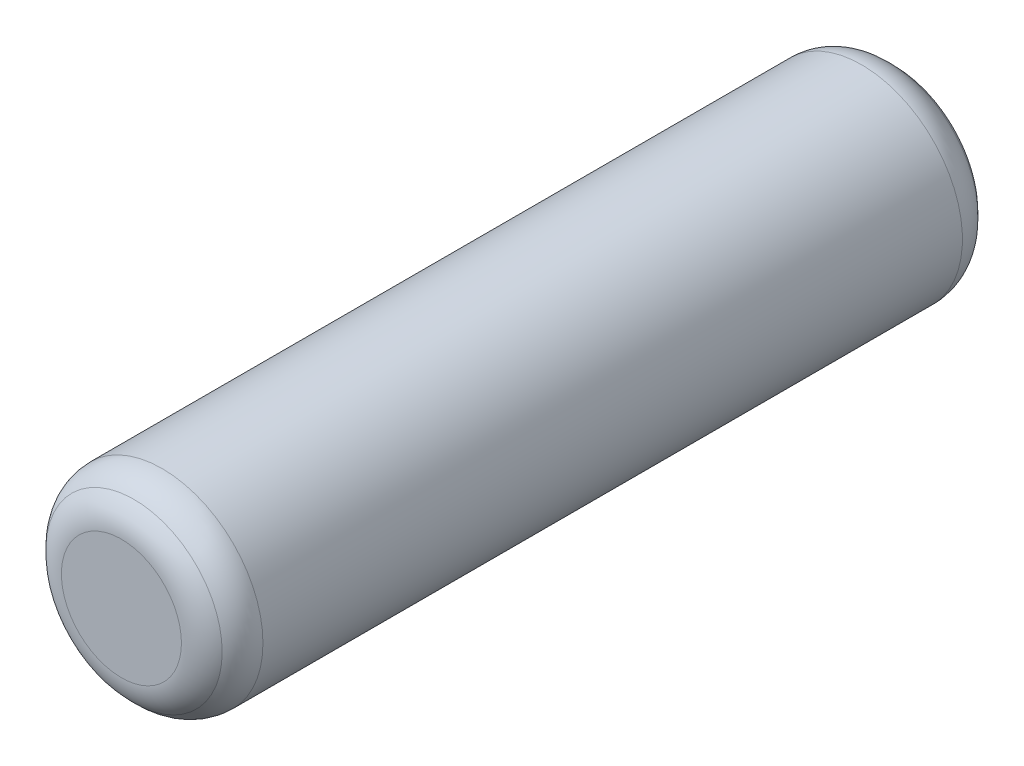
ISO-10303-21;
HEADER;
FILE_DESCRIPTION(('STEP AP214'),'2;1');
FILE_NAME('part.step','',(''),(''),'','','');
FILE_SCHEMA(('AUTOMOTIVE_DESIGN { 1 0 10303 214 1 1 1 1 }'));
ENDSEC;
DATA;
#1=APPLICATION_CONTEXT('core data for automotive mechanical design processes');
#2=APPLICATION_PROTOCOL_DEFINITION('international standard','automotive_design',2000,#1);
#3=PRODUCT_CONTEXT('',#1,'mechanical');
#4=PRODUCT('Part','Part','',(#3));
#5=PRODUCT_RELATED_PRODUCT_CATEGORY('part','',(#4));
#6=PRODUCT_DEFINITION_FORMATION('','',#4);
#7=PRODUCT_DEFINITION_CONTEXT('part definition',#1,'design');
#8=PRODUCT_DEFINITION('design','',#6,#7);
#9=PRODUCT_DEFINITION_SHAPE('','',#8);
#10=(LENGTH_UNIT() NAMED_UNIT(*) SI_UNIT(.MILLI.,.METRE.));
#11=(NAMED_UNIT(*) PLANE_ANGLE_UNIT() SI_UNIT($,.RADIAN.));
#12=(NAMED_UNIT(*) SI_UNIT($,.STERADIAN.) SOLID_ANGLE_UNIT());
#13=UNCERTAINTY_MEASURE_WITH_UNIT(LENGTH_MEASURE(1.E-05),#10,'distance_accuracy_value','');
#14=(GEOMETRIC_REPRESENTATION_CONTEXT(3) GLOBAL_UNCERTAINTY_ASSIGNED_CONTEXT((#13)) GLOBAL_UNIT_ASSIGNED_CONTEXT((#10,
#11,#12)) REPRESENTATION_CONTEXT('',''));
#15=CARTESIAN_POINT('',(0.,0.,0.));
#16=DIRECTION('',(0.,0.,1.));
#17=DIRECTION('',(1.,0.,0.));
#18=AXIS2_PLACEMENT_3D('',#15,#16,#17);
#19=CARTESIAN_POINT('',(0.,0.,15.));
#20=DIRECTION('',(0.,0.,-1.));
#21=DIRECTION('',(-1.,0.,0.));
#22=AXIS2_PLACEMENT_3D('',#19,#20,#21);
#23=CYLINDRICAL_SURFACE('',#22,2.);
#24=CARTESIAN_POINT('',(0.,0.,0.559016994374948));
#25=DIRECTION('',(0.,0.,-1.));
#26=DIRECTION('',(-1.,0.,0.));
#27=AXIS2_PLACEMENT_3D('',#24,#25,#26);
#28=CIRCLE('',#27,2.);
#29=CARTESIAN_POINT('',(-2.,0.,0.559016994374948));
#30=VERTEX_POINT('',#29);
#31=EDGE_CURVE('E50',#30,#30,#28,.F.);
#32=ORIENTED_EDGE('',*,*,#31,.T.);
#33=EDGE_LOOP('',(#32));
#34=FACE_BOUND('',#33,.T.);
#35=CARTESIAN_POINT('',(0.,0.,14.4409830056251));
#36=DIRECTION('',(0.,0.,1.));
#37=DIRECTION('',(1.,0.,0.));
#38=AXIS2_PLACEMENT_3D('',#35,#36,#37);
#39=CIRCLE('',#38,2.);
#40=CARTESIAN_POINT('',(2.,0.,14.4409830056251));
#41=VERTEX_POINT('',#40);
#42=EDGE_CURVE('E72',#41,#41,#39,.F.);
#43=ORIENTED_EDGE('',*,*,#42,.T.);
#44=EDGE_LOOP('',(#43));
#45=FACE_BOUND('',#44,.T.);
#46=ADVANCED_FACE('F39',(#34,#45),#23,.T.);
#47=CARTESIAN_POINT('',(0.,0.,15.25));
#48=DIRECTION('',(0.,0.,1.));
#49=DIRECTION('',(1.,0.,0.));
#50=AXIS2_PLACEMENT_3D('',#47,#48,#49);
#51=PLANE('',#50);
#52=CARTESIAN_POINT('',(0.,0.,15.25));
#53=DIRECTION('',(0.,0.,1.));
#54=DIRECTION('',(1.,0.,0.));
#55=AXIS2_PLACEMENT_3D('',#52,#53,#54);
#56=CIRCLE('',#55,1.19098300562505);
#57=CARTESIAN_POINT('',(1.19098300562505,0.,15.25));
#58=VERTEX_POINT('',#57);
#59=EDGE_CURVE('E68',#58,#58,#56,.T.);
#60=ORIENTED_EDGE('',*,*,#59,.T.);
#61=EDGE_LOOP('',(#60));
#62=FACE_BOUND('',#61,.T.);
#63=ADVANCED_FACE('F90',(#62),#51,.T.);
#64=CARTESIAN_POINT('',(0.,0.,14.5));
#65=DIRECTION('',(0.,0.,-1.));
#66=DIRECTION('',(-1.,0.,0.));
#67=AXIS2_PLACEMENT_3D('',#64,#65,#66);
#68=TOROIDAL_SURFACE('',#67,1.19098300562505,0.75);
#69=ORIENTED_EDGE('',*,*,#59,.F.);
#70=EDGE_LOOP('',(#69));
#71=FACE_BOUND('',#70,.T.);
#72=CARTESIAN_POINT('',(0.,0.,15.));
#73=DIRECTION('',(0.,0.,1.));
#74=DIRECTION('',(1.,0.,0.));
#75=AXIS2_PLACEMENT_3D('',#72,#73,#74);
#76=CIRCLE('',#75,1.75);
#77=CARTESIAN_POINT('',(1.75,0.,15.));
#78=VERTEX_POINT('',#77);
#79=EDGE_CURVE('E62',#78,#78,#76,.F.);
#80=ORIENTED_EDGE('',*,*,#79,.F.);
#81=EDGE_LOOP('',(#80));
#82=FACE_BOUND('',#81,.T.);
#83=ADVANCED_FACE('F85',(#71,#82),#68,.T.);
#84=CARTESIAN_POINT('',(0.,0.,14.4409830056251));
#85=DIRECTION('',(0.,0.,1.));
#86=DIRECTION('',(1.,0.,0.));
#87=AXIS2_PLACEMENT_3D('',#84,#85,#86);
#88=TOROIDAL_SURFACE('',#87,1.25,0.75);
#89=ORIENTED_EDGE('',*,*,#42,.F.);
#90=EDGE_LOOP('',(#89));
#91=FACE_BOUND('',#90,.T.);
#92=ORIENTED_EDGE('',*,*,#79,.T.);
#93=EDGE_LOOP('',(#92));
#94=FACE_BOUND('',#93,.T.);
#95=ADVANCED_FACE('F81',(#91,#94),#88,.T.);
#96=CARTESIAN_POINT('',(0.,0.,-0.25));
#97=DIRECTION('',(0.,0.,-1.));
#98=DIRECTION('',(-1.,0.,0.));
#99=AXIS2_PLACEMENT_3D('',#96,#97,#98);
#100=PLANE('',#99);
#101=CARTESIAN_POINT('',(0.,0.,-0.25));
#102=DIRECTION('',(0.,0.,-1.));
#103=DIRECTION('',(-1.,0.,0.));
#104=AXIS2_PLACEMENT_3D('',#101,#102,#103);
#105=CIRCLE('',#104,1.19098300562505);
#106=CARTESIAN_POINT('',(-1.19098300562505,0.,-0.25));
#107=VERTEX_POINT('',#106);
#108=EDGE_CURVE('E11',#107,#107,#105,.T.);
#109=ORIENTED_EDGE('',*,*,#108,.T.);
#110=EDGE_LOOP('',(#109));
#111=FACE_BOUND('',#110,.T.);
#112=ADVANCED_FACE('F84',(#111),#100,.T.);
#113=CARTESIAN_POINT('',(0.,0.,0.5));
#114=DIRECTION('',(0.,0.,1.));
#115=DIRECTION('',(1.,0.,0.));
#116=AXIS2_PLACEMENT_3D('',#113,#114,#115);
#117=TOROIDAL_SURFACE('',#116,1.19098300562505,0.75);
#118=ORIENTED_EDGE('',*,*,#108,.F.);
#119=EDGE_LOOP('',(#118));
#120=FACE_BOUND('',#119,.T.);
#121=CARTESIAN_POINT('',(0.,0.,0.));
#122=DIRECTION('',(0.,0.,-1.));
#123=DIRECTION('',(-1.,0.,0.));
#124=AXIS2_PLACEMENT_3D('',#121,#122,#123);
#125=CIRCLE('',#124,1.75);
#126=CARTESIAN_POINT('',(-1.75,0.,0.));
#127=VERTEX_POINT('',#126);
#128=CARTESIAN_POINT('',(1.75,0.,0.));
#129=VERTEX_POINT('',#128);
#130=EDGE_CURVE('E43',#127,#129,#125,.F.);
#131=ORIENTED_EDGE('',*,*,#130,.F.);
#132=CARTESIAN_POINT('',(0.,0.,0.));
#133=DIRECTION('',(0.,0.,-1.));
#134=DIRECTION('',(-1.,0.,0.));
#135=AXIS2_PLACEMENT_3D('',#132,#133,#134);
#136=CIRCLE('',#135,1.75);
#137=EDGE_CURVE('E60',#129,#127,#136,.F.);
#138=ORIENTED_EDGE('',*,*,#137,.F.);
#139=EDGE_LOOP('',(#131,#138));
#140=FACE_BOUND('',#139,.T.);
#141=ADVANCED_FACE('F41',(#120,#140),#117,.T.);
#142=CARTESIAN_POINT('',(0.,0.,0.559016994374947));
#143=DIRECTION('',(0.,0.,-1.));
#144=DIRECTION('',(-1.,0.,0.));
#145=AXIS2_PLACEMENT_3D('',#142,#143,#144);
#146=TOROIDAL_SURFACE('',#145,1.25,0.75);
#147=ORIENTED_EDGE('',*,*,#137,.T.);
#148=ORIENTED_EDGE('',*,*,#130,.T.);
#149=EDGE_LOOP('',(#147,#148));
#150=FACE_BOUND('',#149,.T.);
#151=ORIENTED_EDGE('',*,*,#31,.F.);
#152=EDGE_LOOP('',(#151));
#153=FACE_BOUND('',#152,.T.);
#154=ADVANCED_FACE('F58',(#150,#153),#146,.T.);
#155=CLOSED_SHELL('',(#46,#63,#83,#95,#112,#141,#154));
#156=MANIFOLD_SOLID_BREP('B2',#155);
#157=ADVANCED_BREP_SHAPE_REPRESENTATION('',(#18,#156),#14);
#158=SHAPE_DEFINITION_REPRESENTATION(#9,#157);
ENDSEC;
END-ISO-10303-21;
